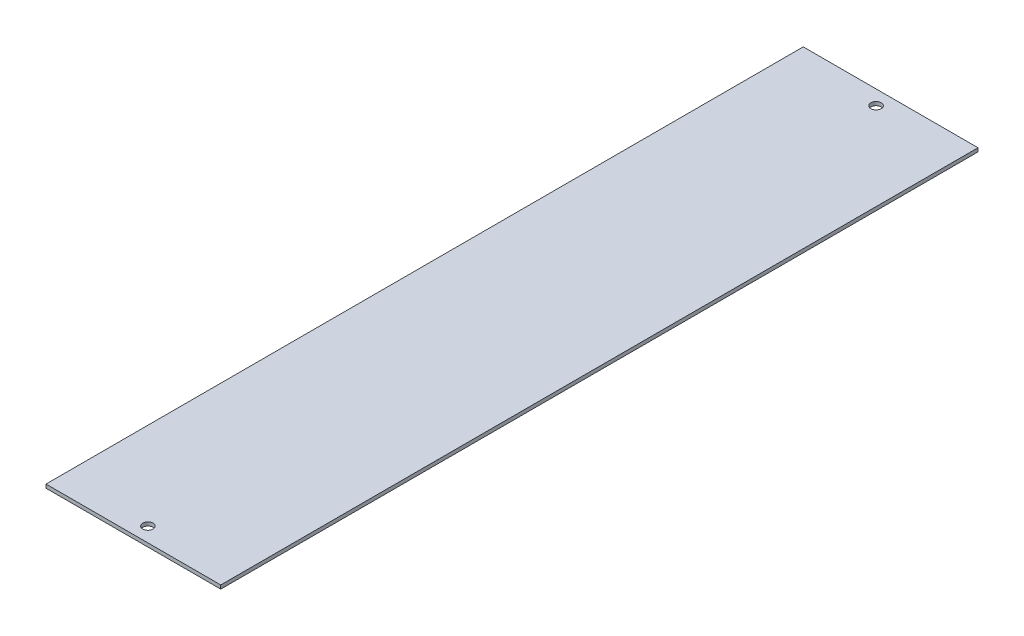
ISO-10303-21;
HEADER;
FILE_DESCRIPTION(('STEP AP214'),'2;1');
FILE_NAME('part.step','',(''),(''),'','','');
FILE_SCHEMA(('AUTOMOTIVE_DESIGN { 1 0 10303 214 1 1 1 1 }'));
ENDSEC;
DATA;
#1=APPLICATION_CONTEXT('core data for automotive mechanical design processes');
#2=APPLICATION_PROTOCOL_DEFINITION('international standard','automotive_design',2000,#1);
#3=PRODUCT_CONTEXT('',#1,'mechanical');
#4=PRODUCT('Part','Part','',(#3));
#5=PRODUCT_RELATED_PRODUCT_CATEGORY('part','',(#4));
#6=PRODUCT_DEFINITION_FORMATION('','',#4);
#7=PRODUCT_DEFINITION_CONTEXT('part definition',#1,'design');
#8=PRODUCT_DEFINITION('design','',#6,#7);
#9=PRODUCT_DEFINITION_SHAPE('','',#8);
#10=(LENGTH_UNIT() NAMED_UNIT(*) SI_UNIT(.MILLI.,.METRE.));
#11=(NAMED_UNIT(*) PLANE_ANGLE_UNIT() SI_UNIT($,.RADIAN.));
#12=(NAMED_UNIT(*) SI_UNIT($,.STERADIAN.) SOLID_ANGLE_UNIT());
#13=UNCERTAINTY_MEASURE_WITH_UNIT(LENGTH_MEASURE(1.E-05),#10,'distance_accuracy_value','');
#14=(GEOMETRIC_REPRESENTATION_CONTEXT(3) GLOBAL_UNCERTAINTY_ASSIGNED_CONTEXT((#13)) GLOBAL_UNIT_ASSIGNED_CONTEXT((#10,
#11,#12)) REPRESENTATION_CONTEXT('',''));
#15=CARTESIAN_POINT('',(0.,0.,0.));
#16=DIRECTION('',(0.,0.,1.));
#17=DIRECTION('',(1.,0.,0.));
#18=AXIS2_PLACEMENT_3D('',#15,#16,#17);
#19=CARTESIAN_POINT('',(0.,1.5875,0.));
#20=DIRECTION('',(0.,-1.,0.));
#21=DIRECTION('',(0.,0.,-1.));
#22=AXIS2_PLACEMENT_3D('',#19,#20,#21);
#23=PLANE('',#22);
#24=DIRECTION('',(0.,0.,-1.));
#25=VECTOR('',#24,1.);
#26=CARTESIAN_POINT('',(0.,1.5875,0.));
#27=LINE('',#26,#25);
#28=CARTESIAN_POINT('',(0.,1.5875,330.2));
#29=VERTEX_POINT('',#28);
#30=CARTESIAN_POINT('',(0.,1.5875,0.));
#31=VERTEX_POINT('',#30);
#32=EDGE_CURVE('E92',#29,#31,#27,.T.);
#33=ORIENTED_EDGE('',*,*,#32,.T.);
#34=DIRECTION('',(-1.,0.,0.));
#35=VECTOR('',#34,1.);
#36=CARTESIAN_POINT('',(0.,1.5875,0.));
#37=LINE('',#36,#35);
#38=CARTESIAN_POINT('',(-76.2,1.5875,0.));
#39=VERTEX_POINT('',#38);
#40=EDGE_CURVE('E87',#31,#39,#37,.T.);
#41=ORIENTED_EDGE('',*,*,#40,.T.);
#42=DIRECTION('',(0.,0.,1.));
#43=VECTOR('',#42,1.);
#44=CARTESIAN_POINT('',(-76.2,1.5875,0.));
#45=LINE('',#44,#43);
#46=CARTESIAN_POINT('',(-76.2,1.5875,330.2));
#47=VERTEX_POINT('',#46);
#48=EDGE_CURVE('E90',#39,#47,#45,.T.);
#49=ORIENTED_EDGE('',*,*,#48,.T.);
#50=DIRECTION('',(1.,0.,0.));
#51=VECTOR('',#50,1.);
#52=CARTESIAN_POINT('',(0.,1.5875,330.2));
#53=LINE('',#52,#51);
#54=EDGE_CURVE('E57',#47,#29,#53,.T.);
#55=ORIENTED_EDGE('',*,*,#54,.T.);
#56=EDGE_LOOP('',(#33,#41,#49,#55));
#57=FACE_BOUND('',#56,.T.);
#58=CARTESIAN_POINT('',(-38.1,1.5875,6.35));
#59=DIRECTION('',(0.,1.,0.));
#60=DIRECTION('',(0.,0.,1.));
#61=AXIS2_PLACEMENT_3D('',#58,#59,#60);
#62=CIRCLE('',#61,2.25);
#63=CARTESIAN_POINT('',(-38.1,1.5875,8.60000000000001));
#64=VERTEX_POINT('',#63);
#65=EDGE_CURVE('E112',#64,#64,#62,.T.);
#66=ORIENTED_EDGE('',*,*,#65,.F.);
#67=EDGE_LOOP('',(#66));
#68=FACE_BOUND('',#67,.T.);
#69=CARTESIAN_POINT('',(-38.1,1.5875,323.85));
#70=DIRECTION('',(0.,1.,0.));
#71=DIRECTION('',(0.,0.,1.));
#72=AXIS2_PLACEMENT_3D('',#69,#70,#71);
#73=CIRCLE('',#72,2.25);
#74=CARTESIAN_POINT('',(-38.1,1.5875,326.1));
#75=VERTEX_POINT('',#74);
#76=EDGE_CURVE('E134',#75,#75,#73,.T.);
#77=ORIENTED_EDGE('',*,*,#76,.F.);
#78=EDGE_LOOP('',(#77));
#79=FACE_BOUND('',#78,.T.);
#80=ADVANCED_FACE('F39',(#57,#68,#79),#23,.F.);
#81=CARTESIAN_POINT('',(0.,0.,0.));
#82=DIRECTION('',(0.,-1.,0.));
#83=DIRECTION('',(0.,0.,-1.));
#84=AXIS2_PLACEMENT_3D('',#81,#82,#83);
#85=PLANE('',#84);
#86=CARTESIAN_POINT('',(-38.1,0.,6.35));
#87=DIRECTION('',(0.,1.,0.));
#88=DIRECTION('',(0.,0.,1.));
#89=AXIS2_PLACEMENT_3D('',#86,#87,#88);
#90=CIRCLE('',#89,2.25);
#91=CARTESIAN_POINT('',(-38.1,0.,8.60000000000001));
#92=VERTEX_POINT('',#91);
#93=EDGE_CURVE('E130',#92,#92,#90,.T.);
#94=ORIENTED_EDGE('',*,*,#93,.T.);
#95=EDGE_LOOP('',(#94));
#96=FACE_BOUND('',#95,.T.);
#97=DIRECTION('',(0.,0.,-1.));
#98=VECTOR('',#97,1.);
#99=CARTESIAN_POINT('',(0.,0.,0.));
#100=LINE('',#99,#98);
#101=CARTESIAN_POINT('',(0.,0.,330.2));
#102=VERTEX_POINT('',#101);
#103=CARTESIAN_POINT('',(0.,0.,0.));
#104=VERTEX_POINT('',#103);
#105=EDGE_CURVE('E108',#102,#104,#100,.T.);
#106=ORIENTED_EDGE('',*,*,#105,.F.);
#107=DIRECTION('',(1.,0.,0.));
#108=VECTOR('',#107,1.);
#109=CARTESIAN_POINT('',(0.,0.,330.2));
#110=LINE('',#109,#108);
#111=CARTESIAN_POINT('',(-76.2,0.,330.2));
#112=VERTEX_POINT('',#111);
#113=EDGE_CURVE('E80',#112,#102,#110,.T.);
#114=ORIENTED_EDGE('',*,*,#113,.F.);
#115=DIRECTION('',(0.,0.,1.));
#116=VECTOR('',#115,1.);
#117=CARTESIAN_POINT('',(-76.2,0.,0.));
#118=LINE('',#117,#116);
#119=CARTESIAN_POINT('',(-76.2,0.,0.));
#120=VERTEX_POINT('',#119);
#121=EDGE_CURVE('E74',#120,#112,#118,.T.);
#122=ORIENTED_EDGE('',*,*,#121,.F.);
#123=DIRECTION('',(-1.,0.,0.));
#124=VECTOR('',#123,1.);
#125=CARTESIAN_POINT('',(0.,0.,0.));
#126=LINE('',#125,#124);
#127=EDGE_CURVE('E97',#104,#120,#126,.T.);
#128=ORIENTED_EDGE('',*,*,#127,.F.);
#129=EDGE_LOOP('',(#106,#114,#122,#128));
#130=FACE_BOUND('',#129,.T.);
#131=CARTESIAN_POINT('',(-38.1,0.,323.85));
#132=DIRECTION('',(0.,1.,0.));
#133=DIRECTION('',(0.,0.,1.));
#134=AXIS2_PLACEMENT_3D('',#131,#132,#133);
#135=CIRCLE('',#134,2.25);
#136=CARTESIAN_POINT('',(-38.1,0.,326.1));
#137=VERTEX_POINT('',#136);
#138=EDGE_CURVE('E138',#137,#137,#135,.T.);
#139=ORIENTED_EDGE('',*,*,#138,.T.);
#140=EDGE_LOOP('',(#139));
#141=FACE_BOUND('',#140,.T.);
#142=ADVANCED_FACE('F125',(#96,#130,#141),#85,.T.);
#143=CARTESIAN_POINT('',(0.,1.5875,0.));
#144=DIRECTION('',(-1.,0.,0.));
#145=DIRECTION('',(0.,0.,1.));
#146=AXIS2_PLACEMENT_3D('',#143,#144,#145);
#147=PLANE('',#146);
#148=ORIENTED_EDGE('',*,*,#105,.T.);
#149=DIRECTION('',(0.,-1.,0.));
#150=VECTOR('',#149,1.);
#151=CARTESIAN_POINT('',(0.,1.5875,0.));
#152=LINE('',#151,#150);
#153=EDGE_CURVE('E11',#31,#104,#152,.T.);
#154=ORIENTED_EDGE('',*,*,#153,.F.);
#155=ORIENTED_EDGE('',*,*,#32,.F.);
#156=DIRECTION('',(0.,-1.,0.));
#157=VECTOR('',#156,1.);
#158=CARTESIAN_POINT('',(0.,1.5875,330.2));
#159=LINE('',#158,#157);
#160=EDGE_CURVE('E104',#29,#102,#159,.T.);
#161=ORIENTED_EDGE('',*,*,#160,.T.);
#162=EDGE_LOOP('',(#148,#154,#155,#161));
#163=FACE_BOUND('',#162,.T.);
#164=ADVANCED_FACE('F41',(#163),#147,.F.);
#165=CARTESIAN_POINT('',(0.,1.5875,0.));
#166=DIRECTION('',(0.,0.,1.));
#167=DIRECTION('',(1.,0.,0.));
#168=AXIS2_PLACEMENT_3D('',#165,#166,#167);
#169=PLANE('',#168);
#170=ORIENTED_EDGE('',*,*,#127,.T.);
#171=DIRECTION('',(0.,-1.,0.));
#172=VECTOR('',#171,1.);
#173=CARTESIAN_POINT('',(-76.2,1.5875,0.));
#174=LINE('',#173,#172);
#175=EDGE_CURVE('E49',#39,#120,#174,.T.);
#176=ORIENTED_EDGE('',*,*,#175,.F.);
#177=ORIENTED_EDGE('',*,*,#40,.F.);
#178=ORIENTED_EDGE('',*,*,#153,.T.);
#179=EDGE_LOOP('',(#170,#176,#177,#178));
#180=FACE_BOUND('',#179,.T.);
#181=ADVANCED_FACE('F96',(#180),#169,.F.);
#182=CARTESIAN_POINT('',(-76.2,1.5875,0.));
#183=DIRECTION('',(1.,0.,0.));
#184=DIRECTION('',(0.,0.,-1.));
#185=AXIS2_PLACEMENT_3D('',#182,#183,#184);
#186=PLANE('',#185);
#187=ORIENTED_EDGE('',*,*,#121,.T.);
#188=DIRECTION('',(0.,-1.,0.));
#189=VECTOR('',#188,1.);
#190=CARTESIAN_POINT('',(-76.2,1.5875,330.2));
#191=LINE('',#190,#189);
#192=EDGE_CURVE('E99',#47,#112,#191,.T.);
#193=ORIENTED_EDGE('',*,*,#192,.F.);
#194=ORIENTED_EDGE('',*,*,#48,.F.);
#195=ORIENTED_EDGE('',*,*,#175,.T.);
#196=EDGE_LOOP('',(#187,#193,#194,#195));
#197=FACE_BOUND('',#196,.T.);
#198=ADVANCED_FACE('F100',(#197),#186,.F.);
#199=CARTESIAN_POINT('',(0.,1.5875,330.2));
#200=DIRECTION('',(0.,0.,-1.));
#201=DIRECTION('',(-1.,0.,0.));
#202=AXIS2_PLACEMENT_3D('',#199,#200,#201);
#203=PLANE('',#202);
#204=ORIENTED_EDGE('',*,*,#113,.T.);
#205=ORIENTED_EDGE('',*,*,#160,.F.);
#206=ORIENTED_EDGE('',*,*,#54,.F.);
#207=ORIENTED_EDGE('',*,*,#192,.T.);
#208=EDGE_LOOP('',(#204,#205,#206,#207));
#209=FACE_BOUND('',#208,.T.);
#210=ADVANCED_FACE('F122',(#209),#203,.F.);
#211=CARTESIAN_POINT('',(-38.1,1.5875,6.35));
#212=DIRECTION('',(0.,-1.,0.));
#213=DIRECTION('',(0.,0.,-1.));
#214=AXIS2_PLACEMENT_3D('',#211,#212,#213);
#215=CYLINDRICAL_SURFACE('',#214,2.25);
#216=ORIENTED_EDGE('',*,*,#65,.T.);
#217=EDGE_LOOP('',(#216));
#218=FACE_BOUND('',#217,.T.);
#219=ORIENTED_EDGE('',*,*,#93,.F.);
#220=EDGE_LOOP('',(#219));
#221=FACE_BOUND('',#220,.T.);
#222=ADVANCED_FACE('F157',(#218,#221),#215,.F.);
#223=CARTESIAN_POINT('',(-38.1,1.5875,323.85));
#224=DIRECTION('',(0.,-1.,0.));
#225=DIRECTION('',(0.,0.,-1.));
#226=AXIS2_PLACEMENT_3D('',#223,#224,#225);
#227=CYLINDRICAL_SURFACE('',#226,2.25);
#228=ORIENTED_EDGE('',*,*,#76,.T.);
#229=EDGE_LOOP('',(#228));
#230=FACE_BOUND('',#229,.T.);
#231=ORIENTED_EDGE('',*,*,#138,.F.);
#232=EDGE_LOOP('',(#231));
#233=FACE_BOUND('',#232,.T.);
#234=ADVANCED_FACE('F146',(#230,#233),#227,.F.);
#235=CLOSED_SHELL('',(#80,#142,#164,#181,#198,#210,#222,#234));
#236=MANIFOLD_SOLID_BREP('B2',#235);
#237=ADVANCED_BREP_SHAPE_REPRESENTATION('',(#18,#236),#14);
#238=SHAPE_DEFINITION_REPRESENTATION(#9,#237);
ENDSEC;
END-ISO-10303-21;
